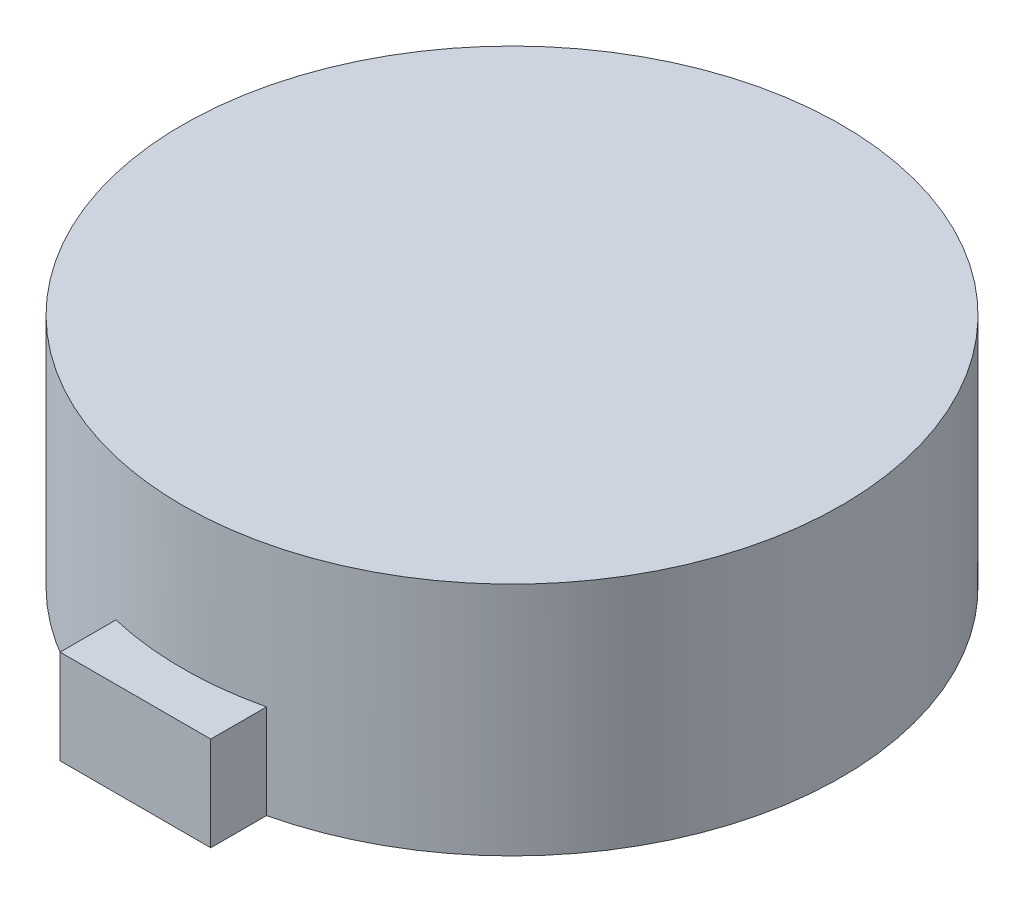
ISO-10303-21;
HEADER;
FILE_DESCRIPTION(('STEP AP214'),'2;1');
FILE_NAME('part.step','',(''),(''),'','','');
FILE_SCHEMA(('AUTOMOTIVE_DESIGN { 1 0 10303 214 1 1 1 1 }'));
ENDSEC;
DATA;
#1=APPLICATION_CONTEXT('core data for automotive mechanical design processes');
#2=APPLICATION_PROTOCOL_DEFINITION('international standard','automotive_design',2000,#1);
#3=PRODUCT_CONTEXT('',#1,'mechanical');
#4=PRODUCT('Part','Part','',(#3));
#5=PRODUCT_RELATED_PRODUCT_CATEGORY('part','',(#4));
#6=PRODUCT_DEFINITION_FORMATION('','',#4);
#7=PRODUCT_DEFINITION_CONTEXT('part definition',#1,'design');
#8=PRODUCT_DEFINITION('design','',#6,#7);
#9=PRODUCT_DEFINITION_SHAPE('','',#8);
#10=(LENGTH_UNIT() NAMED_UNIT(*) SI_UNIT(.MILLI.,.METRE.));
#11=(NAMED_UNIT(*) PLANE_ANGLE_UNIT() SI_UNIT($,.RADIAN.));
#12=(NAMED_UNIT(*) SI_UNIT($,.STERADIAN.) SOLID_ANGLE_UNIT());
#13=UNCERTAINTY_MEASURE_WITH_UNIT(LENGTH_MEASURE(1.E-05),#10,'distance_accuracy_value','');
#14=(GEOMETRIC_REPRESENTATION_CONTEXT(3) GLOBAL_UNCERTAINTY_ASSIGNED_CONTEXT((#13)) GLOBAL_UNIT_ASSIGNED_CONTEXT((#10,
#11,#12)) REPRESENTATION_CONTEXT('',''));
#15=CARTESIAN_POINT('',(0.,0.,0.));
#16=DIRECTION('',(0.,0.,1.));
#17=DIRECTION('',(1.,0.,0.));
#18=AXIS2_PLACEMENT_3D('',#15,#16,#17);
#19=CARTESIAN_POINT('',(0.,3.175,0.));
#20=DIRECTION('',(0.,-1.,0.));
#21=DIRECTION('',(0.,0.,-1.));
#22=AXIS2_PLACEMENT_3D('',#19,#20,#21);
#23=CYLINDRICAL_SURFACE('',#22,4.445);
#24=CARTESIAN_POINT('',(0.,3.175,0.));
#25=DIRECTION('',(0.,1.,0.));
#26=DIRECTION('',(0.,0.,1.));
#27=AXIS2_PLACEMENT_3D('',#24,#25,#26);
#28=CIRCLE('',#27,4.445);
#29=CARTESIAN_POINT('',(0.,3.175,4.445));
#30=VERTEX_POINT('',#29);
#31=EDGE_CURVE('E11',#30,#30,#28,.T.);
#32=ORIENTED_EDGE('',*,*,#31,.F.);
#33=EDGE_LOOP('',(#32));
#34=FACE_BOUND('',#33,.T.);
#35=CARTESIAN_POINT('',(0.,0.,0.));
#36=DIRECTION('',(0.,1.,0.));
#37=DIRECTION('',(0.,0.,1.));
#38=AXIS2_PLACEMENT_3D('',#35,#36,#37);
#39=CIRCLE('',#38,4.445);
#40=CARTESIAN_POINT('',(1.016,0.,4.32732815949981));
#41=VERTEX_POINT('',#40);
#42=CARTESIAN_POINT('',(-1.016,0.,4.32732815949981));
#43=VERTEX_POINT('',#42);
#44=EDGE_CURVE('E44',#41,#43,#39,.T.);
#45=ORIENTED_EDGE('',*,*,#44,.T.);
#46=DIRECTION('',(0.,-1.,0.));
#47=VECTOR('',#46,1.);
#48=CARTESIAN_POINT('',(-1.016,1.27,4.32732815949981));
#49=LINE('',#48,#47);
#50=CARTESIAN_POINT('',(-1.016,1.27,4.32732815949981));
#51=VERTEX_POINT('',#50);
#52=EDGE_CURVE('E56',#51,#43,#49,.T.);
#53=ORIENTED_EDGE('',*,*,#52,.F.);
#54=CARTESIAN_POINT('',(0.,1.27,0.));
#55=DIRECTION('',(0.,-1.,0.));
#56=DIRECTION('',(0.,0.,-1.));
#57=AXIS2_PLACEMENT_3D('',#54,#55,#56);
#58=CIRCLE('',#57,4.445);
#59=CARTESIAN_POINT('',(1.016,1.27,4.32732815949981));
#60=VERTEX_POINT('',#59);
#61=EDGE_CURVE('E60',#60,#51,#58,.T.);
#62=ORIENTED_EDGE('',*,*,#61,.F.);
#63=DIRECTION('',(0.,-1.,0.));
#64=VECTOR('',#63,1.);
#65=CARTESIAN_POINT('',(1.016,1.27,4.32732815949981));
#66=LINE('',#65,#64);
#67=EDGE_CURVE('E94',#60,#41,#66,.T.);
#68=ORIENTED_EDGE('',*,*,#67,.T.);
#69=EDGE_LOOP('',(#45,#53,#62,#68));
#70=FACE_BOUND('',#69,.T.);
#71=ADVANCED_FACE('F41',(#34,#70),#23,.T.);
#72=CARTESIAN_POINT('',(0.,3.175,0.));
#73=DIRECTION('',(0.,1.,0.));
#74=DIRECTION('',(0.,0.,1.));
#75=AXIS2_PLACEMENT_3D('',#72,#73,#74);
#76=PLANE('',#75);
#77=ORIENTED_EDGE('',*,*,#31,.T.);
#78=EDGE_LOOP('',(#77));
#79=FACE_BOUND('',#78,.T.);
#80=ADVANCED_FACE('F138',(#79),#76,.T.);
#81=CARTESIAN_POINT('',(0.,0.,0.));
#82=DIRECTION('',(0.,1.,0.));
#83=DIRECTION('',(0.,0.,1.));
#84=AXIS2_PLACEMENT_3D('',#81,#82,#83);
#85=PLANE('',#84);
#86=ORIENTED_EDGE('',*,*,#44,.F.);
#87=DIRECTION('',(0.,0.,-1.));
#88=VECTOR('',#87,1.);
#89=CARTESIAN_POINT('',(1.016,0.,0.));
#90=LINE('',#89,#88);
#91=CARTESIAN_POINT('',(1.016,0.,5.08));
#92=VERTEX_POINT('',#91);
#93=EDGE_CURVE('E111',#92,#41,#90,.T.);
#94=ORIENTED_EDGE('',*,*,#93,.F.);
#95=DIRECTION('',(-1.,0.,0.));
#96=VECTOR('',#95,1.);
#97=CARTESIAN_POINT('',(0.,0.,5.08));
#98=LINE('',#97,#96);
#99=CARTESIAN_POINT('',(-1.016,0.,5.08));
#100=VERTEX_POINT('',#99);
#101=EDGE_CURVE('E88',#92,#100,#98,.T.);
#102=ORIENTED_EDGE('',*,*,#101,.T.);
#103=DIRECTION('',(0.,0.,-1.));
#104=VECTOR('',#103,1.);
#105=CARTESIAN_POINT('',(-1.016,0.,0.));
#106=LINE('',#105,#104);
#107=EDGE_CURVE('E116',#100,#43,#106,.T.);
#108=ORIENTED_EDGE('',*,*,#107,.T.);
#109=EDGE_LOOP('',(#86,#94,#102,#108));
#110=FACE_BOUND('',#109,.T.);
#111=ADVANCED_FACE('F126',(#110),#85,.F.);
#112=CARTESIAN_POINT('',(-1.016,1.27,0.));
#113=DIRECTION('',(-1.,0.,0.));
#114=DIRECTION('',(0.,0.,1.));
#115=AXIS2_PLACEMENT_3D('',#112,#113,#114);
#116=PLANE('',#115);
#117=ORIENTED_EDGE('',*,*,#107,.F.);
#118=DIRECTION('',(0.,-1.,0.));
#119=VECTOR('',#118,1.);
#120=CARTESIAN_POINT('',(-1.016,1.27,5.08));
#121=LINE('',#120,#119);
#122=CARTESIAN_POINT('',(-1.016,1.27,5.08));
#123=VERTEX_POINT('',#122);
#124=EDGE_CURVE('E93',#123,#100,#121,.T.);
#125=ORIENTED_EDGE('',*,*,#124,.F.);
#126=DIRECTION('',(0.,0.,-1.));
#127=VECTOR('',#126,1.);
#128=CARTESIAN_POINT('',(-1.016,1.27,0.));
#129=LINE('',#128,#127);
#130=EDGE_CURVE('E104',#123,#51,#129,.T.);
#131=ORIENTED_EDGE('',*,*,#130,.T.);
#132=ORIENTED_EDGE('',*,*,#52,.T.);
#133=EDGE_LOOP('',(#117,#125,#131,#132));
#134=FACE_BOUND('',#133,.T.);
#135=ADVANCED_FACE('F130',(#134),#116,.T.);
#136=CARTESIAN_POINT('',(0.,1.27,5.08));
#137=DIRECTION('',(0.,0.,1.));
#138=DIRECTION('',(1.,0.,0.));
#139=AXIS2_PLACEMENT_3D('',#136,#137,#138);
#140=PLANE('',#139);
#141=ORIENTED_EDGE('',*,*,#101,.F.);
#142=DIRECTION('',(0.,-1.,0.));
#143=VECTOR('',#142,1.);
#144=CARTESIAN_POINT('',(1.016,1.27,5.08));
#145=LINE('',#144,#143);
#146=CARTESIAN_POINT('',(1.016,1.27,5.08));
#147=VERTEX_POINT('',#146);
#148=EDGE_CURVE('E81',#147,#92,#145,.T.);
#149=ORIENTED_EDGE('',*,*,#148,.F.);
#150=DIRECTION('',(-1.,0.,0.));
#151=VECTOR('',#150,1.);
#152=CARTESIAN_POINT('',(0.,1.27,5.08));
#153=LINE('',#152,#151);
#154=EDGE_CURVE('E85',#147,#123,#153,.T.);
#155=ORIENTED_EDGE('',*,*,#154,.T.);
#156=ORIENTED_EDGE('',*,*,#124,.T.);
#157=EDGE_LOOP('',(#141,#149,#155,#156));
#158=FACE_BOUND('',#157,.T.);
#159=ADVANCED_FACE('F83',(#158),#140,.T.);
#160=CARTESIAN_POINT('',(1.016,1.27,0.));
#161=DIRECTION('',(-1.,0.,0.));
#162=DIRECTION('',(0.,0.,1.));
#163=AXIS2_PLACEMENT_3D('',#160,#161,#162);
#164=PLANE('',#163);
#165=ORIENTED_EDGE('',*,*,#93,.T.);
#166=ORIENTED_EDGE('',*,*,#67,.F.);
#167=DIRECTION('',(0.,0.,-1.));
#168=VECTOR('',#167,1.);
#169=CARTESIAN_POINT('',(1.016,1.27,0.));
#170=LINE('',#169,#168);
#171=EDGE_CURVE('E97',#147,#60,#170,.T.);
#172=ORIENTED_EDGE('',*,*,#171,.F.);
#173=ORIENTED_EDGE('',*,*,#148,.T.);
#174=EDGE_LOOP('',(#165,#166,#172,#173));
#175=FACE_BOUND('',#174,.T.);
#176=ADVANCED_FACE('F98',(#175),#164,.F.);
#177=CARTESIAN_POINT('',(0.,1.27,0.));
#178=DIRECTION('',(0.,-1.,0.));
#179=DIRECTION('',(0.,0.,-1.));
#180=AXIS2_PLACEMENT_3D('',#177,#178,#179);
#181=PLANE('',#180);
#182=ORIENTED_EDGE('',*,*,#61,.T.);
#183=ORIENTED_EDGE('',*,*,#130,.F.);
#184=ORIENTED_EDGE('',*,*,#154,.F.);
#185=ORIENTED_EDGE('',*,*,#171,.T.);
#186=EDGE_LOOP('',(#182,#183,#184,#185));
#187=FACE_BOUND('',#186,.T.);
#188=ADVANCED_FACE('F102',(#187),#181,.F.);
#189=CLOSED_SHELL('',(#71,#80,#111,#135,#159,#176,#188));
#190=MANIFOLD_SOLID_BREP('B2',#189);
#191=ADVANCED_BREP_SHAPE_REPRESENTATION('',(#18,#190),#14);
#192=SHAPE_DEFINITION_REPRESENTATION(#9,#191);
ENDSEC;
END-ISO-10303-21;
